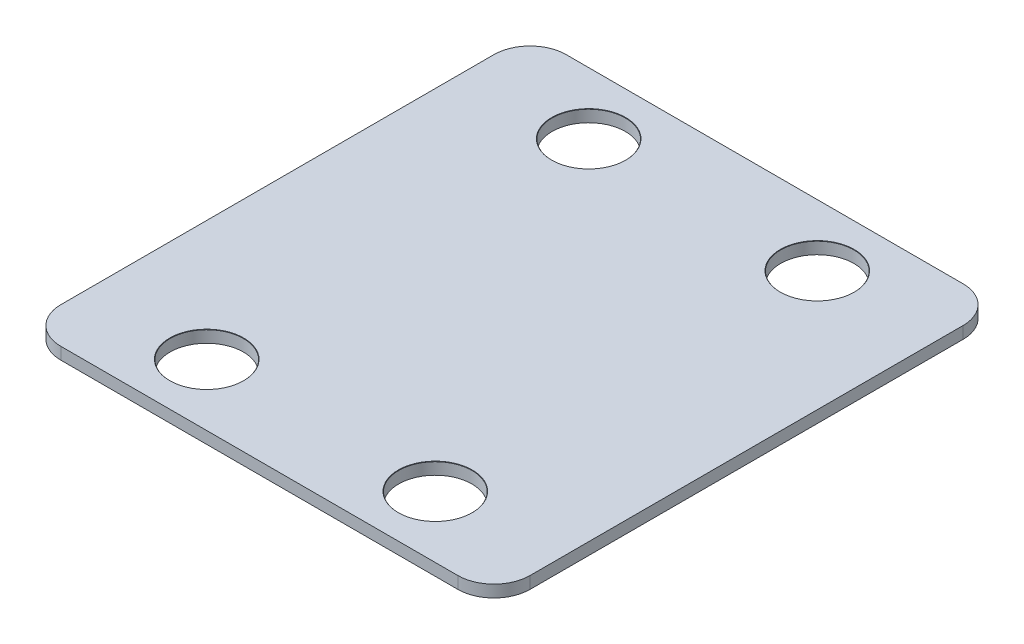
ISO-10303-21;
HEADER;
FILE_DESCRIPTION(('STEP AP214'),'2;1');
FILE_NAME('part.step','',(''),(''),'','','');
FILE_SCHEMA(('AUTOMOTIVE_DESIGN { 1 0 10303 214 1 1 1 1 }'));
ENDSEC;
DATA;
#1=APPLICATION_CONTEXT('core data for automotive mechanical design processes');
#2=APPLICATION_PROTOCOL_DEFINITION('international standard','automotive_design',2000,#1);
#3=PRODUCT_CONTEXT('',#1,'mechanical');
#4=PRODUCT('Part','Part','',(#3));
#5=PRODUCT_RELATED_PRODUCT_CATEGORY('part','',(#4));
#6=PRODUCT_DEFINITION_FORMATION('','',#4);
#7=PRODUCT_DEFINITION_CONTEXT('part definition',#1,'design');
#8=PRODUCT_DEFINITION('design','',#6,#7);
#9=PRODUCT_DEFINITION_SHAPE('','',#8);
#10=(LENGTH_UNIT() NAMED_UNIT(*) SI_UNIT(.MILLI.,.METRE.));
#11=(NAMED_UNIT(*) PLANE_ANGLE_UNIT() SI_UNIT($,.RADIAN.));
#12=(NAMED_UNIT(*) SI_UNIT($,.STERADIAN.) SOLID_ANGLE_UNIT());
#13=UNCERTAINTY_MEASURE_WITH_UNIT(LENGTH_MEASURE(1.E-05),#10,'distance_accuracy_value','');
#14=(GEOMETRIC_REPRESENTATION_CONTEXT(3) GLOBAL_UNCERTAINTY_ASSIGNED_CONTEXT((#13)) GLOBAL_UNIT_ASSIGNED_CONTEXT((#10,
#11,#12)) REPRESENTATION_CONTEXT('',''));
#15=CARTESIAN_POINT('',(0.,0.,0.));
#16=DIRECTION('',(0.,0.,1.));
#17=DIRECTION('',(1.,0.,0.));
#18=AXIS2_PLACEMENT_3D('',#15,#16,#17);
#19=CARTESIAN_POINT('',(0.,0.,0.));
#20=DIRECTION('',(0.,-1.,0.));
#21=DIRECTION('',(0.,0.,-1.));
#22=AXIS2_PLACEMENT_3D('',#19,#20,#21);
#23=PLANE('',#22);
#24=CARTESIAN_POINT('',(-9.50000000000001,0.,-15.8750000000001));
#25=DIRECTION('',(0.,1.,0.));
#26=DIRECTION('',(0.,0.,1.));
#27=AXIS2_PLACEMENT_3D('',#24,#25,#26);
#28=CIRCLE('',#27,3.075);
#29=CARTESIAN_POINT('',(-9.50000000000001,0.,-12.8000000000001));
#30=VERTEX_POINT('',#29);
#31=EDGE_CURVE('E208',#30,#30,#28,.T.);
#32=ORIENTED_EDGE('',*,*,#31,.F.);
#33=EDGE_LOOP('',(#32));
#34=FACE_BOUND('',#33,.T.);
#35=CARTESIAN_POINT('',(9.49999999999999,0.,15.8749999999998));
#36=DIRECTION('',(0.,1.,0.));
#37=DIRECTION('',(0.,0.,1.));
#38=AXIS2_PLACEMENT_3D('',#35,#36,#37);
#39=CIRCLE('',#38,3.075);
#40=CARTESIAN_POINT('',(9.49999999999999,0.,18.9499999999998));
#41=VERTEX_POINT('',#40);
#42=EDGE_CURVE('E199',#41,#41,#39,.T.);
#43=ORIENTED_EDGE('',*,*,#42,.F.);
#44=EDGE_LOOP('',(#43));
#45=FACE_BOUND('',#44,.T.);
#46=CARTESIAN_POINT('',(-9.50000000000001,0.,15.8749999999998));
#47=DIRECTION('',(0.,1.,0.));
#48=DIRECTION('',(0.,0.,1.));
#49=AXIS2_PLACEMENT_3D('',#46,#47,#48);
#50=CIRCLE('',#49,3.075);
#51=CARTESIAN_POINT('',(-9.50000000000001,0.,18.9499999999998));
#52=VERTEX_POINT('',#51);
#53=EDGE_CURVE('E190',#52,#52,#50,.T.);
#54=ORIENTED_EDGE('',*,*,#53,.F.);
#55=EDGE_LOOP('',(#54));
#56=FACE_BOUND('',#55,.T.);
#57=DIRECTION('',(0.,0.,-1.));
#58=VECTOR('',#57,1.);
#59=CARTESIAN_POINT('',(19.5,0.,21.));
#60=LINE('',#59,#58);
#61=CARTESIAN_POINT('',(19.5,0.,18.));
#62=VERTEX_POINT('',#61);
#63=CARTESIAN_POINT('',(19.5,0.,-18.));
#64=VERTEX_POINT('',#63);
#65=EDGE_CURVE('E106',#62,#64,#60,.T.);
#66=ORIENTED_EDGE('',*,*,#65,.T.);
#67=CARTESIAN_POINT('',(16.5,0.,-18.));
#68=DIRECTION('',(0.,-1.,0.));
#69=DIRECTION('',(0.,0.,-1.));
#70=AXIS2_PLACEMENT_3D('',#67,#68,#69);
#71=CIRCLE('',#70,3.);
#72=CARTESIAN_POINT('',(16.5,0.,-21.));
#73=VERTEX_POINT('',#72);
#74=EDGE_CURVE('E140',#64,#73,#71,.F.);
#75=ORIENTED_EDGE('',*,*,#74,.T.);
#76=DIRECTION('',(-1.,0.,0.));
#77=VECTOR('',#76,1.);
#78=CARTESIAN_POINT('',(-19.5,0.,-21.));
#79=LINE('',#78,#77);
#80=CARTESIAN_POINT('',(-16.5,0.,-21.));
#81=VERTEX_POINT('',#80);
#82=EDGE_CURVE('E123',#73,#81,#79,.T.);
#83=ORIENTED_EDGE('',*,*,#82,.T.);
#84=CARTESIAN_POINT('',(-16.5,0.,-18.));
#85=DIRECTION('',(0.,-1.,0.));
#86=DIRECTION('',(0.,0.,-1.));
#87=AXIS2_PLACEMENT_3D('',#84,#85,#86);
#88=CIRCLE('',#87,3.);
#89=CARTESIAN_POINT('',(-19.5,0.,-18.));
#90=VERTEX_POINT('',#89);
#91=EDGE_CURVE('E138',#81,#90,#88,.F.);
#92=ORIENTED_EDGE('',*,*,#91,.T.);
#93=DIRECTION('',(0.,0.,1.));
#94=VECTOR('',#93,1.);
#95=CARTESIAN_POINT('',(-19.5,0.,21.));
#96=LINE('',#95,#94);
#97=CARTESIAN_POINT('',(-19.5,0.,18.));
#98=VERTEX_POINT('',#97);
#99=EDGE_CURVE('E166',#90,#98,#96,.T.);
#100=ORIENTED_EDGE('',*,*,#99,.T.);
#101=CARTESIAN_POINT('',(-16.5,0.,18.));
#102=DIRECTION('',(0.,-1.,0.));
#103=DIRECTION('',(0.,0.,-1.));
#104=AXIS2_PLACEMENT_3D('',#101,#102,#103);
#105=CIRCLE('',#104,3.);
#106=CARTESIAN_POINT('',(-16.5,0.,21.));
#107=VERTEX_POINT('',#106);
#108=EDGE_CURVE('E113',#98,#107,#105,.F.);
#109=ORIENTED_EDGE('',*,*,#108,.T.);
#110=DIRECTION('',(1.,0.,0.));
#111=VECTOR('',#110,1.);
#112=CARTESIAN_POINT('',(-19.5,0.,21.));
#113=LINE('',#112,#111);
#114=CARTESIAN_POINT('',(16.5,0.,21.));
#115=VERTEX_POINT('',#114);
#116=EDGE_CURVE('E108',#107,#115,#113,.T.);
#117=ORIENTED_EDGE('',*,*,#116,.T.);
#118=CARTESIAN_POINT('',(16.5,0.,18.));
#119=DIRECTION('',(0.,-1.,0.));
#120=DIRECTION('',(0.,0.,-1.));
#121=AXIS2_PLACEMENT_3D('',#118,#119,#120);
#122=CIRCLE('',#121,3.);
#123=EDGE_CURVE('E103',#115,#62,#122,.F.);
#124=ORIENTED_EDGE('',*,*,#123,.T.);
#125=EDGE_LOOP('',(#66,#75,#83,#92,#100,#109,#117,#124));
#126=FACE_BOUND('',#125,.T.);
#127=CARTESIAN_POINT('',(9.49999999999998,0.,-15.8750000000001));
#128=DIRECTION('',(0.,1.,0.));
#129=DIRECTION('',(0.,0.,1.));
#130=AXIS2_PLACEMENT_3D('',#127,#128,#129);
#131=CIRCLE('',#130,3.075);
#132=CARTESIAN_POINT('',(9.49999999999998,0.,-12.8000000000001));
#133=VERTEX_POINT('',#132);
#134=EDGE_CURVE('E181',#133,#133,#131,.T.);
#135=ORIENTED_EDGE('',*,*,#134,.F.);
#136=EDGE_LOOP('',(#135));
#137=FACE_BOUND('',#136,.T.);
#138=ADVANCED_FACE('F37',(#34,#45,#56,#126,#137),#23,.F.);
#139=CARTESIAN_POINT('',(19.5,-1.,21.));
#140=DIRECTION('',(1.,0.,0.));
#141=DIRECTION('',(0.,0.,-1.));
#142=AXIS2_PLACEMENT_3D('',#139,#140,#141);
#143=PLANE('',#142);
#144=DIRECTION('',(0.,0.,-1.));
#145=VECTOR('',#144,1.);
#146=CARTESIAN_POINT('',(19.5,-1.,21.));
#147=LINE('',#146,#145);
#148=CARTESIAN_POINT('',(19.5,-1.,18.));
#149=VERTEX_POINT('',#148);
#150=CARTESIAN_POINT('',(19.5,-1.,-18.));
#151=VERTEX_POINT('',#150);
#152=EDGE_CURVE('E168',#149,#151,#147,.T.);
#153=ORIENTED_EDGE('',*,*,#152,.T.);
#154=DIRECTION('',(0.,1.,0.));
#155=VECTOR('',#154,1.);
#156=CARTESIAN_POINT('',(19.5,-1.,-18.));
#157=LINE('',#156,#155);
#158=EDGE_CURVE('E114',#151,#64,#157,.T.);
#159=ORIENTED_EDGE('',*,*,#158,.T.);
#160=ORIENTED_EDGE('',*,*,#65,.F.);
#161=DIRECTION('',(0.,1.,0.));
#162=VECTOR('',#161,1.);
#163=CARTESIAN_POINT('',(19.5,-1.,18.));
#164=LINE('',#163,#162);
#165=EDGE_CURVE('E120',#62,#149,#164,.F.);
#166=ORIENTED_EDGE('',*,*,#165,.T.);
#167=EDGE_LOOP('',(#153,#159,#160,#166));
#168=FACE_BOUND('',#167,.T.);
#169=ADVANCED_FACE('F119',(#168),#143,.T.);
#170=CARTESIAN_POINT('',(-19.5,-1.,21.));
#171=DIRECTION('',(0.,0.,1.));
#172=DIRECTION('',(1.,0.,0.));
#173=AXIS2_PLACEMENT_3D('',#170,#171,#172);
#174=PLANE('',#173);
#175=ORIENTED_EDGE('',*,*,#116,.F.);
#176=DIRECTION('',(0.,1.,0.));
#177=VECTOR('',#176,1.);
#178=CARTESIAN_POINT('',(-16.5,-1.,21.));
#179=LINE('',#178,#177);
#180=CARTESIAN_POINT('',(-16.5,-1.,21.));
#181=VERTEX_POINT('',#180);
#182=EDGE_CURVE('E11',#107,#181,#179,.F.);
#183=ORIENTED_EDGE('',*,*,#182,.T.);
#184=DIRECTION('',(1.,0.,0.));
#185=VECTOR('',#184,1.);
#186=CARTESIAN_POINT('',(-19.5,-1.,21.));
#187=LINE('',#186,#185);
#188=CARTESIAN_POINT('',(16.5,-1.,21.));
#189=VERTEX_POINT('',#188);
#190=EDGE_CURVE('E128',#181,#189,#187,.T.);
#191=ORIENTED_EDGE('',*,*,#190,.T.);
#192=DIRECTION('',(0.,1.,0.));
#193=VECTOR('',#192,1.);
#194=CARTESIAN_POINT('',(16.5,-1.,21.));
#195=LINE('',#194,#193);
#196=EDGE_CURVE('E45',#189,#115,#195,.T.);
#197=ORIENTED_EDGE('',*,*,#196,.T.);
#198=EDGE_LOOP('',(#175,#183,#191,#197));
#199=FACE_BOUND('',#198,.T.);
#200=ADVANCED_FACE('F157',(#199),#174,.T.);
#201=CARTESIAN_POINT('',(-19.5,-1.,21.));
#202=DIRECTION('',(-1.,0.,0.));
#203=DIRECTION('',(0.,0.,1.));
#204=AXIS2_PLACEMENT_3D('',#201,#202,#203);
#205=PLANE('',#204);
#206=ORIENTED_EDGE('',*,*,#99,.F.);
#207=DIRECTION('',(0.,1.,0.));
#208=VECTOR('',#207,1.);
#209=CARTESIAN_POINT('',(-19.5,-1.,-18.));
#210=LINE('',#209,#208);
#211=CARTESIAN_POINT('',(-19.5,-1.,-18.));
#212=VERTEX_POINT('',#211);
#213=EDGE_CURVE('E59',#90,#212,#210,.F.);
#214=ORIENTED_EDGE('',*,*,#213,.T.);
#215=DIRECTION('',(0.,0.,1.));
#216=VECTOR('',#215,1.);
#217=CARTESIAN_POINT('',(-19.5,-1.,21.));
#218=LINE('',#217,#216);
#219=CARTESIAN_POINT('',(-19.5,-1.,18.));
#220=VERTEX_POINT('',#219);
#221=EDGE_CURVE('E132',#212,#220,#218,.T.);
#222=ORIENTED_EDGE('',*,*,#221,.T.);
#223=DIRECTION('',(0.,1.,0.));
#224=VECTOR('',#223,1.);
#225=CARTESIAN_POINT('',(-19.5,-1.,18.));
#226=LINE('',#225,#224);
#227=EDGE_CURVE('E153',#220,#98,#226,.T.);
#228=ORIENTED_EDGE('',*,*,#227,.T.);
#229=EDGE_LOOP('',(#206,#214,#222,#228));
#230=FACE_BOUND('',#229,.T.);
#231=ADVANCED_FACE('F165',(#230),#205,.T.);
#232=CARTESIAN_POINT('',(-19.5,-1.,-21.));
#233=DIRECTION('',(0.,0.,-1.));
#234=DIRECTION('',(-1.,0.,0.));
#235=AXIS2_PLACEMENT_3D('',#232,#233,#234);
#236=PLANE('',#235);
#237=ORIENTED_EDGE('',*,*,#82,.F.);
#238=DIRECTION('',(0.,1.,0.));
#239=VECTOR('',#238,1.);
#240=CARTESIAN_POINT('',(16.5,-1.,-21.));
#241=LINE('',#240,#239);
#242=CARTESIAN_POINT('',(16.5,-1.,-21.));
#243=VERTEX_POINT('',#242);
#244=EDGE_CURVE('E145',#73,#243,#241,.F.);
#245=ORIENTED_EDGE('',*,*,#244,.T.);
#246=DIRECTION('',(-1.,0.,0.));
#247=VECTOR('',#246,1.);
#248=CARTESIAN_POINT('',(-19.5,-1.,-21.));
#249=LINE('',#248,#247);
#250=CARTESIAN_POINT('',(-16.5,-1.,-21.));
#251=VERTEX_POINT('',#250);
#252=EDGE_CURVE('E172',#243,#251,#249,.T.);
#253=ORIENTED_EDGE('',*,*,#252,.T.);
#254=DIRECTION('',(0.,1.,0.));
#255=VECTOR('',#254,1.);
#256=CARTESIAN_POINT('',(-16.5,-1.,-21.));
#257=LINE('',#256,#255);
#258=EDGE_CURVE('E142',#251,#81,#257,.T.);
#259=ORIENTED_EDGE('',*,*,#258,.T.);
#260=EDGE_LOOP('',(#237,#245,#253,#259));
#261=FACE_BOUND('',#260,.T.);
#262=ADVANCED_FACE('F249',(#261),#236,.T.);
#263=CARTESIAN_POINT('',(0.,-1.,0.));
#264=DIRECTION('',(0.,-1.,0.));
#265=DIRECTION('',(0.,0.,-1.));
#266=AXIS2_PLACEMENT_3D('',#263,#264,#265);
#267=PLANE('',#266);
#268=CARTESIAN_POINT('',(-9.50000000000001,-1.,-15.8750000000001));
#269=DIRECTION('',(0.,1.,0.));
#270=DIRECTION('',(0.,0.,1.));
#271=AXIS2_PLACEMENT_3D('',#268,#269,#270);
#272=CIRCLE('',#271,3.05);
#273=CARTESIAN_POINT('',(-9.50000000000001,-1.,-12.8250000000001));
#274=VERTEX_POINT('',#273);
#275=EDGE_CURVE('E202',#274,#274,#272,.T.);
#276=ORIENTED_EDGE('',*,*,#275,.T.);
#277=EDGE_LOOP('',(#276));
#278=FACE_BOUND('',#277,.T.);
#279=CARTESIAN_POINT('',(9.49999999999999,-1.,15.8749999999998));
#280=DIRECTION('',(0.,1.,0.));
#281=DIRECTION('',(0.,0.,1.));
#282=AXIS2_PLACEMENT_3D('',#279,#280,#281);
#283=CIRCLE('',#282,3.05);
#284=CARTESIAN_POINT('',(9.49999999999999,-1.,18.9249999999998));
#285=VERTEX_POINT('',#284);
#286=EDGE_CURVE('E193',#285,#285,#283,.T.);
#287=ORIENTED_EDGE('',*,*,#286,.T.);
#288=EDGE_LOOP('',(#287));
#289=FACE_BOUND('',#288,.T.);
#290=CARTESIAN_POINT('',(-9.50000000000001,-1.,15.8749999999998));
#291=DIRECTION('',(0.,1.,0.));
#292=DIRECTION('',(0.,0.,1.));
#293=AXIS2_PLACEMENT_3D('',#290,#291,#292);
#294=CIRCLE('',#293,3.05);
#295=CARTESIAN_POINT('',(-9.50000000000001,-1.,18.9249999999998));
#296=VERTEX_POINT('',#295);
#297=EDGE_CURVE('E184',#296,#296,#294,.T.);
#298=ORIENTED_EDGE('',*,*,#297,.T.);
#299=EDGE_LOOP('',(#298));
#300=FACE_BOUND('',#299,.T.);
#301=CARTESIAN_POINT('',(9.49999999999998,-1.,-15.8750000000001));
#302=DIRECTION('',(0.,1.,0.));
#303=DIRECTION('',(0.,0.,1.));
#304=AXIS2_PLACEMENT_3D('',#301,#302,#303);
#305=CIRCLE('',#304,3.05);
#306=CARTESIAN_POINT('',(9.49999999999998,-1.,-12.8250000000001));
#307=VERTEX_POINT('',#306);
#308=EDGE_CURVE('E124',#307,#307,#305,.T.);
#309=ORIENTED_EDGE('',*,*,#308,.T.);
#310=EDGE_LOOP('',(#309));
#311=FACE_BOUND('',#310,.T.);
#312=ORIENTED_EDGE('',*,*,#252,.F.);
#313=CARTESIAN_POINT('',(16.5,-1.,-18.));
#314=DIRECTION('',(0.,-1.,0.));
#315=DIRECTION('',(0.,0.,-1.));
#316=AXIS2_PLACEMENT_3D('',#313,#314,#315);
#317=CIRCLE('',#316,3.);
#318=EDGE_CURVE('E151',#243,#151,#317,.T.);
#319=ORIENTED_EDGE('',*,*,#318,.T.);
#320=ORIENTED_EDGE('',*,*,#152,.F.);
#321=CARTESIAN_POINT('',(16.5,-1.,18.));
#322=DIRECTION('',(0.,-1.,0.));
#323=DIRECTION('',(0.,0.,-1.));
#324=AXIS2_PLACEMENT_3D('',#321,#322,#323);
#325=CIRCLE('',#324,3.);
#326=EDGE_CURVE('E127',#149,#189,#325,.T.);
#327=ORIENTED_EDGE('',*,*,#326,.T.);
#328=ORIENTED_EDGE('',*,*,#190,.F.);
#329=CARTESIAN_POINT('',(-16.5,-1.,18.));
#330=DIRECTION('',(0.,-1.,0.));
#331=DIRECTION('',(0.,0.,-1.));
#332=AXIS2_PLACEMENT_3D('',#329,#330,#331);
#333=CIRCLE('',#332,3.);
#334=EDGE_CURVE('E52',#181,#220,#333,.T.);
#335=ORIENTED_EDGE('',*,*,#334,.T.);
#336=ORIENTED_EDGE('',*,*,#221,.F.);
#337=CARTESIAN_POINT('',(-16.5,-1.,-18.));
#338=DIRECTION('',(0.,-1.,0.));
#339=DIRECTION('',(0.,0.,-1.));
#340=AXIS2_PLACEMENT_3D('',#337,#338,#339);
#341=CIRCLE('',#340,3.);
#342=EDGE_CURVE('E149',#212,#251,#341,.T.);
#343=ORIENTED_EDGE('',*,*,#342,.T.);
#344=EDGE_LOOP('',(#312,#319,#320,#327,#328,#335,#336,#343));
#345=FACE_BOUND('',#344,.T.);
#346=ADVANCED_FACE('F160',(#278,#289,#300,#311,#345),#267,.T.);
#347=CARTESIAN_POINT('',(16.5,-1.,-18.));
#348=DIRECTION('',(0.,1.,0.));
#349=DIRECTION('',(0.,0.,1.));
#350=AXIS2_PLACEMENT_3D('',#347,#348,#349);
#351=CYLINDRICAL_SURFACE('',#350,3.);
#352=ORIENTED_EDGE('',*,*,#318,.F.);
#353=ORIENTED_EDGE('',*,*,#244,.F.);
#354=ORIENTED_EDGE('',*,*,#74,.F.);
#355=ORIENTED_EDGE('',*,*,#158,.F.);
#356=EDGE_LOOP('',(#352,#353,#354,#355));
#357=FACE_BOUND('',#356,.T.);
#358=ADVANCED_FACE('F248',(#357),#351,.T.);
#359=CARTESIAN_POINT('',(-16.5,-1.,-18.));
#360=DIRECTION('',(0.,1.,0.));
#361=DIRECTION('',(0.,0.,1.));
#362=AXIS2_PLACEMENT_3D('',#359,#360,#361);
#363=CYLINDRICAL_SURFACE('',#362,3.);
#364=ORIENTED_EDGE('',*,*,#342,.F.);
#365=ORIENTED_EDGE('',*,*,#213,.F.);
#366=ORIENTED_EDGE('',*,*,#91,.F.);
#367=ORIENTED_EDGE('',*,*,#258,.F.);
#368=EDGE_LOOP('',(#364,#365,#366,#367));
#369=FACE_BOUND('',#368,.T.);
#370=ADVANCED_FACE('F263',(#369),#363,.T.);
#371=CARTESIAN_POINT('',(-16.5,-1.,18.));
#372=DIRECTION('',(0.,1.,0.));
#373=DIRECTION('',(0.,0.,1.));
#374=AXIS2_PLACEMENT_3D('',#371,#372,#373);
#375=CYLINDRICAL_SURFACE('',#374,3.);
#376=ORIENTED_EDGE('',*,*,#334,.F.);
#377=ORIENTED_EDGE('',*,*,#182,.F.);
#378=ORIENTED_EDGE('',*,*,#108,.F.);
#379=ORIENTED_EDGE('',*,*,#227,.F.);
#380=EDGE_LOOP('',(#376,#377,#378,#379));
#381=FACE_BOUND('',#380,.T.);
#382=ADVANCED_FACE('F163',(#381),#375,.T.);
#383=CARTESIAN_POINT('',(16.5,-1.,18.));
#384=DIRECTION('',(0.,1.,0.));
#385=DIRECTION('',(0.,0.,1.));
#386=AXIS2_PLACEMENT_3D('',#383,#384,#385);
#387=CYLINDRICAL_SURFACE('',#386,3.);
#388=ORIENTED_EDGE('',*,*,#326,.F.);
#389=ORIENTED_EDGE('',*,*,#165,.F.);
#390=ORIENTED_EDGE('',*,*,#123,.F.);
#391=ORIENTED_EDGE('',*,*,#196,.F.);
#392=EDGE_LOOP('',(#388,#389,#390,#391));
#393=FACE_BOUND('',#392,.T.);
#394=ADVANCED_FACE('F39',(#393),#387,.T.);
#395=CARTESIAN_POINT('',(9.49999999999998,0.,-15.8750000000001));
#396=DIRECTION('',(0.,1.,0.));
#397=DIRECTION('',(0.,0.,1.));
#398=AXIS2_PLACEMENT_3D('',#395,#396,#397);
#399=CYLINDRICAL_SURFACE('',#398,3.05);
#400=ORIENTED_EDGE('',*,*,#308,.F.);
#401=EDGE_LOOP('',(#400));
#402=FACE_BOUND('',#401,.T.);
#403=CARTESIAN_POINT('',(9.49999999999998,-0.0250000000000011,-15.8750000000001));
#404=DIRECTION('',(0.,1.,0.));
#405=DIRECTION('',(0.,0.,1.));
#406=AXIS2_PLACEMENT_3D('',#403,#404,#405);
#407=CIRCLE('',#406,3.05);
#408=CARTESIAN_POINT('',(9.49999999999998,-0.0250000000000011,-12.8250000000001));
#409=VERTEX_POINT('',#408);
#410=EDGE_CURVE('E178',#409,#409,#407,.T.);
#411=ORIENTED_EDGE('',*,*,#410,.T.);
#412=EDGE_LOOP('',(#411));
#413=FACE_BOUND('',#412,.T.);
#414=ADVANCED_FACE('F242',(#402,#413),#399,.F.);
#415=CARTESIAN_POINT('',(9.49999999999998,0.,-15.8750000000001));
#416=DIRECTION('',(0.,1.,0.));
#417=DIRECTION('',(0.,0.,1.));
#418=AXIS2_PLACEMENT_3D('',#415,#416,#417);
#419=CONICAL_SURFACE('',#418,3.075,0.78539816339744);
#420=ORIENTED_EDGE('',*,*,#410,.F.);
#421=EDGE_LOOP('',(#420));
#422=FACE_BOUND('',#421,.T.);
#423=ORIENTED_EDGE('',*,*,#134,.T.);
#424=EDGE_LOOP('',(#423));
#425=FACE_BOUND('',#424,.T.);
#426=ADVANCED_FACE('F234',(#422,#425),#419,.F.);
#427=CARTESIAN_POINT('',(-9.50000000000001,0.,15.8749999999998));
#428=DIRECTION('',(0.,1.,0.));
#429=DIRECTION('',(0.,0.,1.));
#430=AXIS2_PLACEMENT_3D('',#427,#428,#429);
#431=CYLINDRICAL_SURFACE('',#430,3.05);
#432=ORIENTED_EDGE('',*,*,#297,.F.);
#433=EDGE_LOOP('',(#432));
#434=FACE_BOUND('',#433,.T.);
#435=CARTESIAN_POINT('',(-9.50000000000001,-0.0250000000000011,15.8749999999998));
#436=DIRECTION('',(0.,1.,0.));
#437=DIRECTION('',(0.,0.,1.));
#438=AXIS2_PLACEMENT_3D('',#435,#436,#437);
#439=CIRCLE('',#438,3.05);
#440=CARTESIAN_POINT('',(-9.50000000000001,-0.0250000000000011,18.9249999999998));
#441=VERTEX_POINT('',#440);
#442=EDGE_CURVE('E187',#441,#441,#439,.T.);
#443=ORIENTED_EDGE('',*,*,#442,.T.);
#444=EDGE_LOOP('',(#443));
#445=FACE_BOUND('',#444,.T.);
#446=ADVANCED_FACE('F224',(#434,#445),#431,.F.);
#447=CARTESIAN_POINT('',(-9.50000000000001,0.,15.8749999999998));
#448=DIRECTION('',(0.,1.,0.));
#449=DIRECTION('',(0.,0.,1.));
#450=AXIS2_PLACEMENT_3D('',#447,#448,#449);
#451=CONICAL_SURFACE('',#450,3.075,0.785398163397422);
#452=ORIENTED_EDGE('',*,*,#442,.F.);
#453=EDGE_LOOP('',(#452));
#454=FACE_BOUND('',#453,.T.);
#455=ORIENTED_EDGE('',*,*,#53,.T.);
#456=EDGE_LOOP('',(#455));
#457=FACE_BOUND('',#456,.T.);
#458=ADVANCED_FACE('F221',(#454,#457),#451,.F.);
#459=CARTESIAN_POINT('',(9.49999999999999,0.,15.8749999999998));
#460=DIRECTION('',(0.,1.,0.));
#461=DIRECTION('',(0.,0.,1.));
#462=AXIS2_PLACEMENT_3D('',#459,#460,#461);
#463=CYLINDRICAL_SURFACE('',#462,3.05);
#464=ORIENTED_EDGE('',*,*,#286,.F.);
#465=EDGE_LOOP('',(#464));
#466=FACE_BOUND('',#465,.T.);
#467=CARTESIAN_POINT('',(9.49999999999999,-0.0250000000000011,15.8749999999998));
#468=DIRECTION('',(0.,1.,0.));
#469=DIRECTION('',(0.,0.,1.));
#470=AXIS2_PLACEMENT_3D('',#467,#468,#469);
#471=CIRCLE('',#470,3.05);
#472=CARTESIAN_POINT('',(9.49999999999999,-0.0250000000000011,18.9249999999998));
#473=VERTEX_POINT('',#472);
#474=EDGE_CURVE('E196',#473,#473,#471,.T.);
#475=ORIENTED_EDGE('',*,*,#474,.T.);
#476=EDGE_LOOP('',(#475));
#477=FACE_BOUND('',#476,.T.);
#478=ADVANCED_FACE('F223',(#466,#477),#463,.F.);
#479=CARTESIAN_POINT('',(9.49999999999999,0.,15.8749999999998));
#480=DIRECTION('',(0.,1.,0.));
#481=DIRECTION('',(0.,0.,1.));
#482=AXIS2_PLACEMENT_3D('',#479,#480,#481);
#483=CONICAL_SURFACE('',#482,3.075,0.785398163397405);
#484=ORIENTED_EDGE('',*,*,#474,.F.);
#485=EDGE_LOOP('',(#484));
#486=FACE_BOUND('',#485,.T.);
#487=ORIENTED_EDGE('',*,*,#42,.T.);
#488=EDGE_LOOP('',(#487));
#489=FACE_BOUND('',#488,.T.);
#490=ADVANCED_FACE('F231',(#486,#489),#483,.F.);
#491=CARTESIAN_POINT('',(-9.50000000000001,0.,-15.8750000000001));
#492=DIRECTION('',(0.,1.,0.));
#493=DIRECTION('',(0.,0.,1.));
#494=AXIS2_PLACEMENT_3D('',#491,#492,#493);
#495=CYLINDRICAL_SURFACE('',#494,3.05);
#496=ORIENTED_EDGE('',*,*,#275,.F.);
#497=EDGE_LOOP('',(#496));
#498=FACE_BOUND('',#497,.T.);
#499=CARTESIAN_POINT('',(-9.50000000000001,-0.0250000000000011,-15.8750000000001));
#500=DIRECTION('',(0.,1.,0.));
#501=DIRECTION('',(0.,0.,1.));
#502=AXIS2_PLACEMENT_3D('',#499,#500,#501);
#503=CIRCLE('',#502,3.05);
#504=CARTESIAN_POINT('',(-9.50000000000001,-0.0250000000000011,-12.8250000000001));
#505=VERTEX_POINT('',#504);
#506=EDGE_CURVE('E205',#505,#505,#503,.T.);
#507=ORIENTED_EDGE('',*,*,#506,.T.);
#508=EDGE_LOOP('',(#507));
#509=FACE_BOUND('',#508,.T.);
#510=ADVANCED_FACE('F306',(#498,#509),#495,.F.);
#511=CARTESIAN_POINT('',(-9.50000000000001,0.,-15.8750000000001));
#512=DIRECTION('',(0.,1.,0.));
#513=DIRECTION('',(0.,0.,1.));
#514=AXIS2_PLACEMENT_3D('',#511,#512,#513);
#515=CONICAL_SURFACE('',#514,3.075,0.785398163397422);
#516=ORIENTED_EDGE('',*,*,#506,.F.);
#517=EDGE_LOOP('',(#516));
#518=FACE_BOUND('',#517,.T.);
#519=ORIENTED_EDGE('',*,*,#31,.T.);
#520=EDGE_LOOP('',(#519));
#521=FACE_BOUND('',#520,.T.);
#522=ADVANCED_FACE('F212',(#518,#521),#515,.F.);
#523=CLOSED_SHELL('',(#138,#169,#200,#231,#262,#346,#358,#370,#382,#394,#414,#426,#446,#458,
#478,#490,#510,#522));
#524=MANIFOLD_SOLID_BREP('B2',#523);
#525=ADVANCED_BREP_SHAPE_REPRESENTATION('',(#18,#524),#14);
#526=SHAPE_DEFINITION_REPRESENTATION(#9,#525);
ENDSEC;
END-ISO-10303-21;
